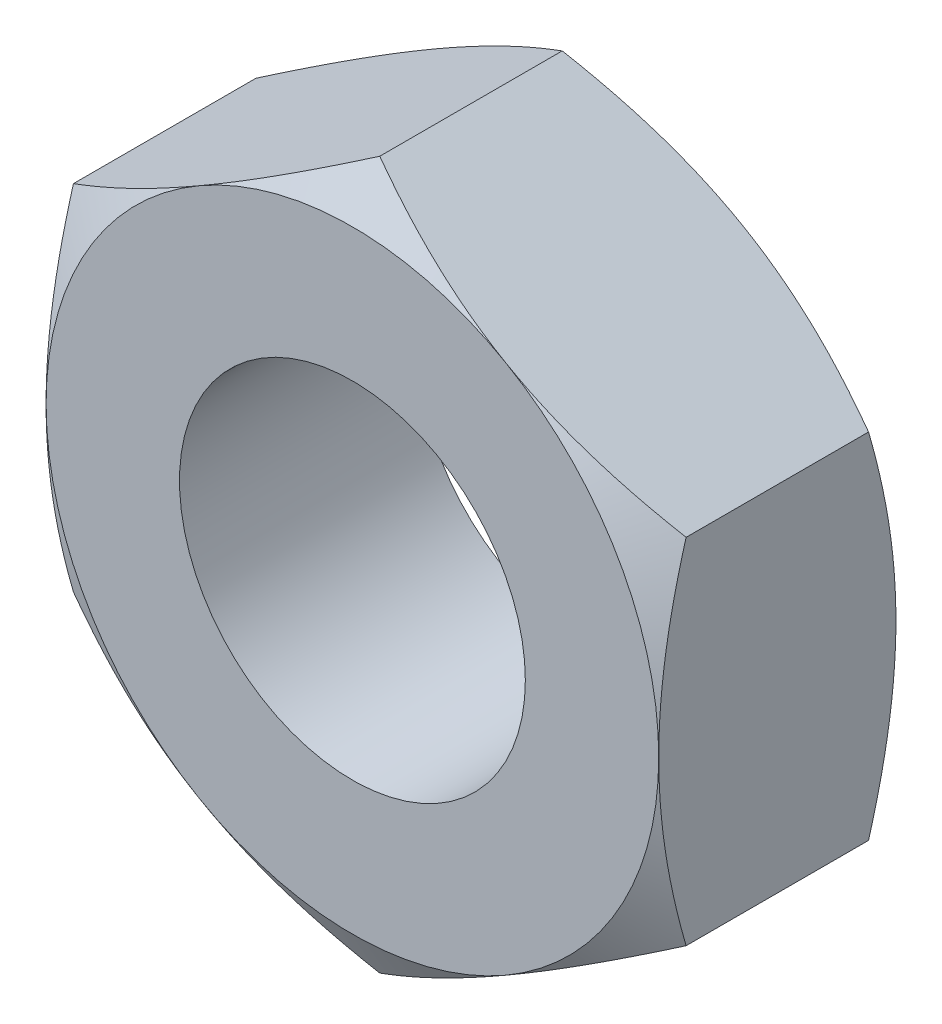
ISO-10303-21;
HEADER;
FILE_DESCRIPTION(('STEP AP214'),'2;1');
FILE_NAME('part.step','',(''),(''),'','','');
FILE_SCHEMA(('AUTOMOTIVE_DESIGN { 1 0 10303 214 1 1 1 1 }'));
ENDSEC;
DATA;
#1=APPLICATION_CONTEXT('core data for automotive mechanical design processes');
#2=APPLICATION_PROTOCOL_DEFINITION('international standard','automotive_design',2000,#1);
#3=PRODUCT_CONTEXT('',#1,'mechanical');
#4=PRODUCT('Part','Part','',(#3));
#5=PRODUCT_RELATED_PRODUCT_CATEGORY('part','',(#4));
#6=PRODUCT_DEFINITION_FORMATION('','',#4);
#7=PRODUCT_DEFINITION_CONTEXT('part definition',#1,'design');
#8=PRODUCT_DEFINITION('design','',#6,#7);
#9=PRODUCT_DEFINITION_SHAPE('','',#8);
#10=(LENGTH_UNIT() NAMED_UNIT(*) SI_UNIT(.MILLI.,.METRE.));
#11=(NAMED_UNIT(*) PLANE_ANGLE_UNIT() SI_UNIT($,.RADIAN.));
#12=(NAMED_UNIT(*) SI_UNIT($,.STERADIAN.) SOLID_ANGLE_UNIT());
#13=UNCERTAINTY_MEASURE_WITH_UNIT(LENGTH_MEASURE(1.E-05),#10,'distance_accuracy_value','');
#14=(GEOMETRIC_REPRESENTATION_CONTEXT(3) GLOBAL_UNCERTAINTY_ASSIGNED_CONTEXT((#13)) GLOBAL_UNIT_ASSIGNED_CONTEXT((#10,
#11,#12)) REPRESENTATION_CONTEXT('',''));
#15=CARTESIAN_POINT('',(0.,0.,0.));
#16=DIRECTION('',(0.,0.,1.));
#17=DIRECTION('',(1.,0.,0.));
#18=AXIS2_PLACEMENT_3D('',#15,#16,#17);
#19=CARTESIAN_POINT('',(3.09999999999999,1.78978583448784,2.4));
#20=DIRECTION('',(-0.500000000000003,-0.866025403784437,0.));
#21=DIRECTION('',(0.866025403784437,-0.500000000000003,0.));
#22=AXIS2_PLACEMENT_3D('',#19,#20,#21);
#23=PLANE('',#22);
#24=DIRECTION('',(0.,0.,-1.));
#25=VECTOR('',#24,1.);
#26=CARTESIAN_POINT('',(3.09999999999999,1.78978583448784,2.4));
#27=LINE('',#26,#25);
#28=CARTESIAN_POINT('',(3.09999999999999,1.78978583448784,2.12311916782118));
#29=VERTEX_POINT('',#28);
#30=CARTESIAN_POINT('',(3.09999999999999,1.78978583448784,0.276880832178823));
#31=VERTEX_POINT('',#30);
#32=EDGE_CURVE('E148',#29,#31,#27,.T.);
#33=ORIENTED_EDGE('',*,*,#32,.T.);
#34=CARTESIAN_POINT('',(3.10019999999999,1.789670364434,0.276947502071192));
#35=CARTESIAN_POINT('',(2.96397039903952,1.86832256122013,0.231520121347388));
#36=CARTESIAN_POINT('',(2.82656487355023,1.94765367834951,0.190205459784695));
#37=CARTESIAN_POINT('',(2.54937446268549,2.10768963667905,0.11809003945012));
#38=CARTESIAN_POINT('',(2.40958465173807,2.18839732165952,0.0873147929162139));
#39=CARTESIAN_POINT('',(2.13173747625081,2.34881246322066,0.0394082767925797));
#40=CARTESIAN_POINT('',(1.99372286382875,2.42849523685464,0.0219581701375264));
#41=CARTESIAN_POINT('',(1.71704417672768,2.58823575133148,0.00112574049382388));
#42=CARTESIAN_POINT('',(1.578381107815,2.66829291149487,-0.00227383287808569));
#43=CARTESIAN_POINT('',(1.31927767786437,2.81788634652482,0.0047954850763409));
#44=CARTESIAN_POINT('',(1.19879854553481,2.88744500600703,0.0135286181637454));
#45=CARTESIAN_POINT('',(0.958625207965761,3.02610914710469,0.0412084477848506));
#46=CARTESIAN_POINT('',(0.838931833544689,3.09521414904691,0.0601646013463644));
#47=CARTESIAN_POINT('',(0.59826323587599,3.23416422869643,0.1075538822576));
#48=CARTESIAN_POINT('',(0.47731847573528,3.30399171852074,0.136187907096622));
#49=CARTESIAN_POINT('',(0.237232901013239,3.44260518971506,0.201176022864358));
#50=CARTESIAN_POINT('',(0.118089010170212,3.51139294716558,0.237514842121463));
#51=CARTESIAN_POINT('',(-0.000200000000002321,3.57968713902953,0.276947502071202));
#52=B_SPLINE_CURVE_WITH_KNOTS('',3,(#34,#35,#36,#37,#38,#39,#40,#41,#42,#43,#44,#45,#46,#47,#48,
#49,#50,#51),.UNSPECIFIED.,.F.,.F.,(4,2,2,2,2,2,2,2,4),(0.,0.491390630656947,0.983962474910791,
1.46434314984851,1.94413386733015,2.36190975222244,2.78007277439126,3.2075118017031,
3.63411139268829),.UNSPECIFIED.);
#53=CARTESIAN_POINT('',(1.55000000000001,2.68467875173175,0.));
#54=VERTEX_POINT('',#53);
#55=EDGE_CURVE('E54',#31,#54,#52,.T.);
#56=ORIENTED_EDGE('',*,*,#55,.T.);
#57=CARTESIAN_POINT('',(0.,3.57957166897569,0.276880832178833));
#58=VERTEX_POINT('',#57);
#59=EDGE_CURVE('E122',#54,#58,#52,.T.);
#60=ORIENTED_EDGE('',*,*,#59,.T.);
#61=DIRECTION('',(0.,0.,-1.));
#62=VECTOR('',#61,1.);
#63=CARTESIAN_POINT('',(0.,3.57957166897569,2.4));
#64=LINE('',#63,#62);
#65=CARTESIAN_POINT('',(0.,3.57957166897569,2.12311916782117));
#66=VERTEX_POINT('',#65);
#67=EDGE_CURVE('E252',#66,#58,#64,.T.);
#68=ORIENTED_EDGE('',*,*,#67,.F.);
#69=CARTESIAN_POINT('',(3.10019999999999,1.789670364434,2.12305249792881));
#70=CARTESIAN_POINT('',(2.96397039903952,1.86832256122013,2.16847987865261));
#71=CARTESIAN_POINT('',(2.82656487355023,1.94765367834951,2.2097945402153));
#72=CARTESIAN_POINT('',(2.54937446268549,2.10768963667905,2.28190996054988));
#73=CARTESIAN_POINT('',(2.40958465173807,2.18839732165952,2.31268520708379));
#74=CARTESIAN_POINT('',(2.13173747625081,2.34881246322066,2.36059172320742));
#75=CARTESIAN_POINT('',(1.99372286382875,2.42849523685464,2.37804182986247));
#76=CARTESIAN_POINT('',(1.71704417672768,2.58823575133148,2.39887425950618));
#77=CARTESIAN_POINT('',(1.578381107815,2.66829291149487,2.40227383287809));
#78=CARTESIAN_POINT('',(1.31927767786437,2.81788634652482,2.39520451492366));
#79=CARTESIAN_POINT('',(1.19879854553481,2.88744500600703,2.38647138183625));
#80=CARTESIAN_POINT('',(0.958625207965761,3.02610914710469,2.35879155221515));
#81=CARTESIAN_POINT('',(0.838931833544689,3.09521414904691,2.33983539865364));
#82=CARTESIAN_POINT('',(0.59826323587599,3.23416422869643,2.2924461177424));
#83=CARTESIAN_POINT('',(0.47731847573528,3.30399171852074,2.26381209290338));
#84=CARTESIAN_POINT('',(0.237232901013238,3.44260518971506,2.19882397713564));
#85=CARTESIAN_POINT('',(0.118089010170212,3.51139294716558,2.16248515787854));
#86=CARTESIAN_POINT('',(-0.00020000000000232,3.57968713902953,2.1230524979288));
#87=B_SPLINE_CURVE_WITH_KNOTS('',3,(#69,#70,#71,#72,#73,#74,#75,#76,#77,#78,#79,#80,#81,#82,#83,
#84,#85,#86),.UNSPECIFIED.,.F.,.F.,(4,2,2,2,2,2,2,2,4),(0.,0.491390630656947,0.983962474910791,
1.46434314984851,1.94413386733015,2.36190975222244,2.78007277439126,3.2075118017031,
3.63411139268829),.UNSPECIFIED.);
#88=CARTESIAN_POINT('',(1.55000000000001,2.68467875173175,2.4));
#89=VERTEX_POINT('',#88);
#90=EDGE_CURVE('E233',#89,#66,#87,.T.);
#91=ORIENTED_EDGE('',*,*,#90,.F.);
#92=EDGE_CURVE('E238',#29,#89,#87,.T.);
#93=ORIENTED_EDGE('',*,*,#92,.F.);
#94=EDGE_LOOP('',(#33,#56,#60,#68,#91,#93));
#95=FACE_BOUND('',#94,.T.);
#96=ADVANCED_FACE('F33',(#95),#23,.F.);
#97=CARTESIAN_POINT('',(0.,3.57957166897569,2.4));
#98=DIRECTION('',(0.5,-0.866025403784439,0.));
#99=DIRECTION('',(0.866025403784439,0.5,0.));
#100=AXIS2_PLACEMENT_3D('',#97,#98,#99);
#101=PLANE('',#100);
#102=ORIENTED_EDGE('',*,*,#67,.T.);
#103=CARTESIAN_POINT('',(0.000199999999997686,3.57968713902953,0.276947502071202));
#104=CARTESIAN_POINT('',(-0.136029600960471,3.50103494224341,0.231520121347397));
#105=CARTESIAN_POINT('',(-0.273435126449768,3.42170382511402,0.190205459784704));
#106=CARTESIAN_POINT('',(-0.550625537314507,3.26166786678448,0.118090039450128));
#107=CARTESIAN_POINT('',(-0.690415348261932,3.18096018180402,0.0873147929162213));
#108=CARTESIAN_POINT('',(-0.968262523749189,3.02054504024287,0.0394082767925861));
#109=CARTESIAN_POINT('',(-1.10627713617125,2.94086226660889,0.0219581701375324));
#110=CARTESIAN_POINT('',(-1.38295582327232,2.78112175213206,0.00112574049382884));
#111=CARTESIAN_POINT('',(-1.521618892185,2.70106459196866,-0.00227383287808141));
#112=CARTESIAN_POINT('',(-1.78072232213563,2.55147115693871,0.00479548507634451));
#113=CARTESIAN_POINT('',(-1.90120145446519,2.4819124974565,0.0135286181637488));
#114=CARTESIAN_POINT('',(-2.14137479203424,2.34324835635884,0.041208447784853));
#115=CARTESIAN_POINT('',(-2.26106816645531,2.27414335441662,0.0601646013463661));
#116=CARTESIAN_POINT('',(-2.50173676412401,2.13519327476711,0.1075538822576));
#117=CARTESIAN_POINT('',(-2.62268152426472,2.0653657849428,0.136187907096622));
#118=CARTESIAN_POINT('',(-2.86276709898676,1.92675231374848,0.201176022864356));
#119=CARTESIAN_POINT('',(-2.98191098982979,1.85796455629796,0.237514842121461));
#120=CARTESIAN_POINT('',(-3.1002,1.78967036443401,0.276947502071198));
#121=B_SPLINE_CURVE_WITH_KNOTS('',3,(#103,#104,#105,#106,#107,#108,#109,#110,#111,#112,#113,
#114,#115,#116,#117,#118,#119,#120),.UNSPECIFIED.,.F.,.F.,(4,2,2,2,2,2,2,2,4),(0.,
0.491390630656949,0.983962474910796,1.46434314984852,1.94413386733016,2.36190975222244,
2.78007277439126,3.2075118017031,3.63411139268829),.UNSPECIFIED.);
#122=CARTESIAN_POINT('',(-1.55,2.68467875173176,0.));
#123=VERTEX_POINT('',#122);
#124=EDGE_CURVE('E127',#58,#123,#121,.T.);
#125=ORIENTED_EDGE('',*,*,#124,.T.);
#126=CARTESIAN_POINT('',(-3.1,1.78978583448785,0.276880832178829));
#127=VERTEX_POINT('',#126);
#128=EDGE_CURVE('E158',#123,#127,#121,.T.);
#129=ORIENTED_EDGE('',*,*,#128,.T.);
#130=DIRECTION('',(0.,0.,-1.));
#131=VECTOR('',#130,1.);
#132=CARTESIAN_POINT('',(-3.1,1.78978583448785,2.4));
#133=LINE('',#132,#131);
#134=CARTESIAN_POINT('',(-3.1,1.78978583448785,2.12311916782117));
#135=VERTEX_POINT('',#134);
#136=EDGE_CURVE('E249',#135,#127,#133,.T.);
#137=ORIENTED_EDGE('',*,*,#136,.F.);
#138=CARTESIAN_POINT('',(0.000199999999997715,3.57968713902953,2.1230524979288));
#139=CARTESIAN_POINT('',(-0.13602960096047,3.50103494224341,2.1684798786526));
#140=CARTESIAN_POINT('',(-0.273435126449768,3.42170382511402,2.2097945402153));
#141=CARTESIAN_POINT('',(-0.550625537314507,3.26166786678448,2.28190996054987));
#142=CARTESIAN_POINT('',(-0.690415348261932,3.18096018180402,2.31268520708378));
#143=CARTESIAN_POINT('',(-0.96826252374919,3.02054504024287,2.36059172320741));
#144=CARTESIAN_POINT('',(-1.10627713617125,2.94086226660889,2.37804182986247));
#145=CARTESIAN_POINT('',(-1.38295582327232,2.78112175213206,2.39887425950617));
#146=CARTESIAN_POINT('',(-1.521618892185,2.70106459196866,2.40227383287808));
#147=CARTESIAN_POINT('',(-1.78072232213563,2.55147115693871,2.39520451492366));
#148=CARTESIAN_POINT('',(-1.90120145446519,2.4819124974565,2.38647138183625));
#149=CARTESIAN_POINT('',(-2.14137479203424,2.34324835635884,2.35879155221515));
#150=CARTESIAN_POINT('',(-2.26106816645531,2.27414335441662,2.33983539865363));
#151=CARTESIAN_POINT('',(-2.50173676412401,2.13519327476711,2.2924461177424));
#152=CARTESIAN_POINT('',(-2.62268152426472,2.0653657849428,2.26381209290338));
#153=CARTESIAN_POINT('',(-2.86276709898676,1.92675231374848,2.19882397713564));
#154=CARTESIAN_POINT('',(-2.98191098982979,1.85796455629796,2.16248515787854));
#155=CARTESIAN_POINT('',(-3.1002,1.78967036443401,2.1230524979288));
#156=B_SPLINE_CURVE_WITH_KNOTS('',3,(#138,#139,#140,#141,#142,#143,#144,#145,#146,#147,#148,
#149,#150,#151,#152,#153,#154,#155),.UNSPECIFIED.,.F.,.F.,(4,2,2,2,2,2,2,2,4),(0.,
0.491390630656949,0.983962474910796,1.46434314984852,1.94413386733016,2.36190975222244,
2.78007277439126,3.2075118017031,3.63411139268828),.UNSPECIFIED.);
#157=CARTESIAN_POINT('',(-1.55,2.68467875173176,2.4));
#158=VERTEX_POINT('',#157);
#159=EDGE_CURVE('E227',#158,#135,#156,.T.);
#160=ORIENTED_EDGE('',*,*,#159,.F.);
#161=EDGE_CURVE('E232',#66,#158,#156,.T.);
#162=ORIENTED_EDGE('',*,*,#161,.F.);
#163=EDGE_LOOP('',(#102,#125,#129,#137,#160,#162));
#164=FACE_BOUND('',#163,.T.);
#165=ADVANCED_FACE('F208',(#164),#101,.F.);
#166=CARTESIAN_POINT('',(-3.1,1.78978583448785,2.4));
#167=DIRECTION('',(1.,0.,0.));
#168=DIRECTION('',(0.,0.,-1.));
#169=AXIS2_PLACEMENT_3D('',#166,#167,#168);
#170=PLANE('',#169);
#171=ORIENTED_EDGE('',*,*,#136,.T.);
#172=CARTESIAN_POINT('',(-3.1,-4.81271311094046,1.51537212886873));
#173=CARTESIAN_POINT('',(-3.1,-4.67725325474317,1.44964135128457));
#174=CARTESIAN_POINT('',(-3.1,-4.54148294955466,1.38453942265156));
#175=CARTESIAN_POINT('',(-3.1,-4.26915632867624,1.25594690533142));
#176=CARTESIAN_POINT('',(-3.1,-4.13259989359762,1.19245656976259));
#177=CARTESIAN_POINT('',(-3.1,-3.85783501166493,1.0671226689302));
#178=CARTESIAN_POINT('',(-3.1,-3.71962162183014,1.00528990264288));
#179=CARTESIAN_POINT('',(-3.1,-3.44209710202229,0.884148548425661));
#180=CARTESIAN_POINT('',(-3.1,-3.30278602418059,0.82483984146936));
#181=CARTESIAN_POINT('',(-3.1,-3.01836843390503,0.707567345806914));
#182=CARTESIAN_POINT('',(-3.1,-2.87321899048361,0.649707109458559));
#183=CARTESIAN_POINT('',(-3.1,-2.58122394562764,0.538353329221752));
#184=CARTESIAN_POINT('',(-3.1,-2.43437815628686,0.484860274489725));
#185=CARTESIAN_POINT('',(-3.1,-2.13902983456276,0.383641069761732));
#186=CARTESIAN_POINT('',(-3.1,-1.99053132448977,0.335903300643239));
#187=CARTESIAN_POINT('',(-3.1,-1.69140436864903,0.247722937455909));
#188=CARTESIAN_POINT('',(-3.1,-1.54077660796244,0.207278052049756));
#189=CARTESIAN_POINT('',(-3.1,-1.23812181195293,0.135831147781954));
#190=CARTESIAN_POINT('',(-3.1,-1.0861068333969,0.104778994885782));
#191=CARTESIAN_POINT('',(-3.1,-0.780181394728635,0.0538767116209993));
#192=CARTESIAN_POINT('',(-3.1,-0.62627112314021,0.0340254761542891));
#193=CARTESIAN_POINT('',(-3.1,-0.31933729668021,0.00736821991208423));
#194=CARTESIAN_POINT('',(-3.1,-0.166328719380625,0.000393994827882272));
#195=CARTESIAN_POINT('',(-3.1,0.139734819209859,-0.000361065698014016));
#196=CARTESIAN_POINT('',(-3.1,0.292789781589653,0.00585843721181667));
#197=CARTESIAN_POINT('',(-3.1,0.552443106279333,0.0271612510733355));
#198=CARTESIAN_POINT('',(-3.1,0.659318893504866,0.0390579331913427));
#199=CARTESIAN_POINT('',(-3.1,0.872287107506994,0.0685471382002425));
#200=CARTESIAN_POINT('',(-3.1,0.978379426731379,0.0861404287666638));
#201=CARTESIAN_POINT('',(-3.1,1.29533767040953,0.146540367741428));
#202=CARTESIAN_POINT('',(-3.1,1.50476964824319,0.196956375066906));
#203=CARTESIAN_POINT('',(-3.1,1.81800503712806,0.284382763522986));
#204=CARTESIAN_POINT('',(-3.1,1.92343087968106,0.31591094426472));
#205=CARTESIAN_POINT('',(-3.1,2.13325801254174,0.382239707814592));
#206=CARTESIAN_POINT('',(-3.1,2.23765929553585,0.41704031396347));
#207=CARTESIAN_POINT('',(-3.1,2.44547137812261,0.489355503889596));
#208=CARTESIAN_POINT('',(-3.1,2.54888248494952,0.526869212755777));
#209=CARTESIAN_POINT('',(-3.1,2.75484704985968,0.604169375182141));
#210=CARTESIAN_POINT('',(-3.1,2.85740052283004,0.643955789197623));
#211=CARTESIAN_POINT('',(-3.1,3.11839129018357,0.748004435854091));
#212=CARTESIAN_POINT('',(-3.1,3.27629298419082,0.813608415178438));
#213=CARTESIAN_POINT('',(-3.1,3.59060726100184,0.948302824176242));
#214=CARTESIAN_POINT('',(-3.1,3.7470197164046,1.01739354900345));
#215=CARTESIAN_POINT('',(-3.1,4.05866673501164,1.15828574602618));
#216=CARTESIAN_POINT('',(-3.1,4.21390096513805,1.23008795280182));
#217=CARTESIAN_POINT('',(-3.1,4.52337536160475,1.37580715153339));
#218=CARTESIAN_POINT('',(-3.1,4.67761550219107,1.44972419801096));
#219=CARTESIAN_POINT('',(-3.1,5.13952618022164,1.67416456655521));
#220=CARTESIAN_POINT('',(-3.1,5.44597971818287,1.82719000894438));
#221=CARTESIAN_POINT('',(-3.1,6.05661946365952,2.13754716786365));
#222=CARTESIAN_POINT('',(-3.1,6.36080603279155,2.29487817803568));
#223=CARTESIAN_POINT('',(-3.1,6.93852747105681,2.59730938966765));
#224=CARTESIAN_POINT('',(-3.1,7.21220559297371,2.74213642536651));
#225=CARTESIAN_POINT('',(-3.1,7.75861182506786,3.03360009879064));
#226=CARTESIAN_POINT('',(-3.1,8.03133988898186,3.18023682310219));
#227=CARTESIAN_POINT('',(-3.1,8.57527114960725,3.47444006014049));
#228=CARTESIAN_POINT('',(-3.1,8.84647647476626,3.6220026425095));
#229=CARTESIAN_POINT('',(-3.1,9.38828987035642,3.91817843806014));
#230=CARTESIAN_POINT('',(-3.1,9.65889797895943,4.06679158138233));
#231=CARTESIAN_POINT('',(-3.1,9.9292920292533,4.21579046875435));
#232=B_SPLINE_CURVE_WITH_KNOTS('',3,(#172,#173,#174,#175,#176,#177,#178,#179,#180,#181,#182,
#183,#184,#185,#186,#187,#188,#189,#190,#191,#192,#193,#194,#195,#196,#197,#198,#199,#200,#201,
#202,#203,#204,#205,#206,#207,#208,#209,#210,#211,#212,#213,#214,#215,#216,#217,#218,#219,#220,
#221,#222,#223,#224,#225,#226,#227,#228,#229,#230,#231),.UNSPECIFIED.,.F.,.F.,(4,2,2,2,2,2,2,2,
2,2,2,2,2,2,2,2,2,2,2,2,2,2,2,2,2,2,2,2,2,4),(0.,0.451701380433486,0.903473271947674,
1.3576953851437,1.81189605491955,2.28061195133272,2.74938027554722,3.21718578487089,
3.68484405819051,4.14996025737442,4.61503055951931,5.07398175344263,5.53294471725493,
5.85539611513145,6.17789098468844,6.8232263366688,7.15331602585133,7.48340806959375,
7.81339413709938,8.14337446464912,8.65627774457848,9.1692245149459,9.68231126132092,
10.1954112472704,11.2229554301614,12.2503320361586,13.1792315129445,14.1081756074621,
15.0344253693908,15.9606141070192),.UNSPECIFIED.);
#233=CARTESIAN_POINT('',(-3.1,0.,0.));
#234=VERTEX_POINT('',#233);
#235=EDGE_CURVE('E202',#127,#234,#232,.F.);
#236=ORIENTED_EDGE('',*,*,#235,.T.);
#237=CARTESIAN_POINT('',(-3.1,-1.78978583448784,0.276880832178825));
#238=VERTEX_POINT('',#237);
#239=EDGE_CURVE('E196',#234,#238,#232,.F.);
#240=ORIENTED_EDGE('',*,*,#239,.T.);
#241=DIRECTION('',(0.,0.,-1.));
#242=VECTOR('',#241,1.);
#243=CARTESIAN_POINT('',(-3.1,-1.78978583448784,2.4));
#244=LINE('',#243,#242);
#245=CARTESIAN_POINT('',(-3.1,-1.78978583448784,2.12311916782117));
#246=VERTEX_POINT('',#245);
#247=EDGE_CURVE('E246',#246,#238,#244,.T.);
#248=ORIENTED_EDGE('',*,*,#247,.F.);
#249=CARTESIAN_POINT('',(-3.1,-4.81271311094046,0.88462787113127));
#250=CARTESIAN_POINT('',(-3.1,-4.67725325474317,0.950358648715434));
#251=CARTESIAN_POINT('',(-3.1,-4.54148294955465,1.01546057734844));
#252=CARTESIAN_POINT('',(-3.1,-4.26915632867624,1.14405309466858));
#253=CARTESIAN_POINT('',(-3.1,-4.13259989359762,1.20754343023741));
#254=CARTESIAN_POINT('',(-3.1,-3.85783501166493,1.3328773310698));
#255=CARTESIAN_POINT('',(-3.1,-3.71962162183014,1.39471009735712));
#256=CARTESIAN_POINT('',(-3.1,-3.44209710202229,1.51585145157434));
#257=CARTESIAN_POINT('',(-3.1,-3.30278602418059,1.57516015853064));
#258=CARTESIAN_POINT('',(-3.1,-3.01836843390503,1.69243265419309));
#259=CARTESIAN_POINT('',(-3.1,-2.87321899048361,1.75029289054144));
#260=CARTESIAN_POINT('',(-3.1,-2.58122394562764,1.86164667077825));
#261=CARTESIAN_POINT('',(-3.1,-2.43437815628686,1.91513972551028));
#262=CARTESIAN_POINT('',(-3.1,-2.13902983456276,2.01635893023827));
#263=CARTESIAN_POINT('',(-3.1,-1.99053132448978,2.06409669935676));
#264=CARTESIAN_POINT('',(-3.1,-1.69140436864903,2.15227706254409));
#265=CARTESIAN_POINT('',(-3.1,-1.54077660796244,2.19272194795024));
#266=CARTESIAN_POINT('',(-3.1,-1.23812181195293,2.26416885221805));
#267=CARTESIAN_POINT('',(-3.1,-1.0861068333969,2.29522100511422));
#268=CARTESIAN_POINT('',(-3.1,-0.780181394728635,2.346123288379));
#269=CARTESIAN_POINT('',(-3.1,-0.62627112314021,2.36597452384571));
#270=CARTESIAN_POINT('',(-3.1,-0.31933729668021,2.39263178008792));
#271=CARTESIAN_POINT('',(-3.1,-0.166328719380624,2.39960600517212));
#272=CARTESIAN_POINT('',(-3.1,0.139734819209859,2.40036106569801));
#273=CARTESIAN_POINT('',(-3.1,0.292789781589653,2.39414156278818));
#274=CARTESIAN_POINT('',(-3.1,0.552443106279333,2.37283874892666));
#275=CARTESIAN_POINT('',(-3.1,0.659318893504865,2.36094206680866));
#276=CARTESIAN_POINT('',(-3.1,0.872287107506993,2.33145286179976));
#277=CARTESIAN_POINT('',(-3.1,0.978379426731378,2.31385957123334));
#278=CARTESIAN_POINT('',(-3.1,1.29533767040953,2.25345963225857));
#279=CARTESIAN_POINT('',(-3.1,1.50476964824319,2.20304362493309));
#280=CARTESIAN_POINT('',(-3.1,1.81800503712806,2.11561723647701));
#281=CARTESIAN_POINT('',(-3.1,1.92343087968106,2.08408905573528));
#282=CARTESIAN_POINT('',(-3.1,2.13325801254174,2.01776029218541));
#283=CARTESIAN_POINT('',(-3.1,2.23765929553584,1.98295968603653));
#284=CARTESIAN_POINT('',(-3.1,2.44547137812261,1.9106444961104));
#285=CARTESIAN_POINT('',(-3.1,2.54888248494952,1.87313078724422));
#286=CARTESIAN_POINT('',(-3.1,2.75484704985968,1.79583062481786));
#287=CARTESIAN_POINT('',(-3.1,2.85740052283004,1.75604421080238));
#288=CARTESIAN_POINT('',(-3.1,3.11839129018357,1.65199556414591));
#289=CARTESIAN_POINT('',(-3.1,3.27629298419082,1.58639158482156));
#290=CARTESIAN_POINT('',(-3.1,3.59060726100184,1.45169717582376));
#291=CARTESIAN_POINT('',(-3.1,3.7470197164046,1.38260645099655));
#292=CARTESIAN_POINT('',(-3.1,4.05866673501164,1.24171425397382));
#293=CARTESIAN_POINT('',(-3.1,4.21390096513805,1.16991204719818));
#294=CARTESIAN_POINT('',(-3.1,4.52337536160475,1.02419284846661));
#295=CARTESIAN_POINT('',(-3.1,4.67761550219108,0.950275801989039));
#296=CARTESIAN_POINT('',(-3.1,5.13952618022164,0.725835433444792));
#297=CARTESIAN_POINT('',(-3.1,5.44597971818287,0.572809991055616));
#298=CARTESIAN_POINT('',(-3.1,6.05661946365952,0.262452832136352));
#299=CARTESIAN_POINT('',(-3.1,6.36080603279155,0.105121821964322));
#300=CARTESIAN_POINT('',(-3.1,6.93852747105682,-0.197309389667646));
#301=CARTESIAN_POINT('',(-3.1,7.21220559297371,-0.342136425366515));
#302=CARTESIAN_POINT('',(-3.1,7.75861182506786,-0.633600098790644));
#303=CARTESIAN_POINT('',(-3.1,8.03133988898186,-0.780236823102191));
#304=CARTESIAN_POINT('',(-3.1,8.57527114960725,-1.07444006014049));
#305=CARTESIAN_POINT('',(-3.1,8.84647647476626,-1.2220026425095));
#306=CARTESIAN_POINT('',(-3.1,9.38828987035642,-1.51817843806014));
#307=CARTESIAN_POINT('',(-3.1,9.65889797895943,-1.66679158138233));
#308=CARTESIAN_POINT('',(-3.1,9.9292920292533,-1.81579046875435));
#309=B_SPLINE_CURVE_WITH_KNOTS('',3,(#249,#250,#251,#252,#253,#254,#255,#256,#257,#258,#259,
#260,#261,#262,#263,#264,#265,#266,#267,#268,#269,#270,#271,#272,#273,#274,#275,#276,#277,#278,
#279,#280,#281,#282,#283,#284,#285,#286,#287,#288,#289,#290,#291,#292,#293,#294,#295,#296,#297,
#298,#299,#300,#301,#302,#303,#304,#305,#306,#307,#308),.UNSPECIFIED.,.F.,.F.,(4,2,2,2,2,2,2,2,
2,2,2,2,2,2,2,2,2,2,2,2,2,2,2,2,2,2,2,2,2,4),(0.,0.451701380433486,0.903473271947673,
1.3576953851437,1.81189605491955,2.28061195133272,2.74938027554722,3.21718578487089,
3.68484405819051,4.14996025737442,4.61503055951931,5.07398175344263,5.53294471725493,
5.85539611513145,6.17789098468843,6.8232263366688,7.15331602585133,7.48340806959375,
7.81339413709938,8.14337446464912,8.65627774457848,9.1692245149459,9.68231126132093,
10.1954112472704,11.2229554301614,12.2503320361586,13.1792315129445,14.1081756074621,
15.0344253693908,15.9606141070192),.UNSPECIFIED.);
#310=CARTESIAN_POINT('',(-3.1,0.,2.4));
#311=VERTEX_POINT('',#310);
#312=EDGE_CURVE('E214',#311,#246,#309,.F.);
#313=ORIENTED_EDGE('',*,*,#312,.F.);
#314=EDGE_CURVE('E220',#135,#311,#309,.F.);
#315=ORIENTED_EDGE('',*,*,#314,.F.);
#316=EDGE_LOOP('',(#171,#236,#240,#248,#313,#315));
#317=FACE_BOUND('',#316,.T.);
#318=ADVANCED_FACE('F204',(#317),#170,.F.);
#319=CARTESIAN_POINT('',(-3.1,-1.78978583448784,2.4));
#320=DIRECTION('',(0.499999999999998,0.86602540378444,0.));
#321=DIRECTION('',(-0.86602540378444,0.499999999999998,0.));
#322=AXIS2_PLACEMENT_3D('',#319,#320,#321);
#323=PLANE('',#322);
#324=ORIENTED_EDGE('',*,*,#247,.T.);
#325=CARTESIAN_POINT('',(-3.1002,-1.789670364434,0.276947502071194));
#326=CARTESIAN_POINT('',(-2.96397039903953,-1.86832256122012,0.23152012134739));
#327=CARTESIAN_POINT('',(-2.82656487355023,-1.94765367834951,0.190205459784696));
#328=CARTESIAN_POINT('',(-2.5493744626855,-2.10768963667905,0.11809003945012));
#329=CARTESIAN_POINT('',(-2.40958465173807,-2.18839732165951,0.0873147929162129));
#330=CARTESIAN_POINT('',(-2.13173747625081,-2.34881246322065,0.0394082767925773));
#331=CARTESIAN_POINT('',(-1.99372286382875,-2.42849523685463,0.0219581701375234));
#332=CARTESIAN_POINT('',(-1.71704417672768,-2.58823575133147,0.00112574049381937));
#333=CARTESIAN_POINT('',(-1.578381107815,-2.66829291149486,-0.00227383287809113));
#334=CARTESIAN_POINT('',(-1.31927767786437,-2.81788634652481,0.00479548507633417));
#335=CARTESIAN_POINT('',(-1.19879854553481,-2.88744500600702,0.0135286181637382));
#336=CARTESIAN_POINT('',(-0.958625207965761,-3.02610914710468,0.0412084477848422));
#337=CARTESIAN_POINT('',(-0.838931833544688,-3.0952141490469,0.0601646013463552));
#338=CARTESIAN_POINT('',(-0.598263235875989,-3.23416422869641,0.107553882257589));
#339=CARTESIAN_POINT('',(-0.477318475735278,-3.30399171852072,0.136187907096612));
#340=CARTESIAN_POINT('',(-0.237232901013235,-3.44260518971504,0.201176022864346));
#341=CARTESIAN_POINT('',(-0.118089010170208,-3.51139294716556,0.237514842121452));
#342=CARTESIAN_POINT('',(0.000200000000006558,-3.57968713902951,0.27694750207119));
#343=B_SPLINE_CURVE_WITH_KNOTS('',3,(#325,#326,#327,#328,#329,#330,#331,#332,#333,#334,#335,
#336,#337,#338,#339,#340,#341,#342),.UNSPECIFIED.,.F.,.F.,(4,2,2,2,2,2,2,2,4),(0.,
0.491390630656948,0.983962474910792,1.46434314984851,1.94413386733015,2.36190975222244,
2.78007277439126,3.2075118017031,3.63411139268829),.UNSPECIFIED.);
#344=CARTESIAN_POINT('',(-1.54999999999999,-2.68467875173176,0.));
#345=VERTEX_POINT('',#344);
#346=EDGE_CURVE('E203',#238,#345,#343,.T.);
#347=ORIENTED_EDGE('',*,*,#346,.T.);
#348=CARTESIAN_POINT('',(0.,-3.57957166897567,0.276880832178821));
#349=VERTEX_POINT('',#348);
#350=EDGE_CURVE('E191',#345,#349,#343,.T.);
#351=ORIENTED_EDGE('',*,*,#350,.T.);
#352=DIRECTION('',(0.,0.,-1.));
#353=VECTOR('',#352,1.);
#354=CARTESIAN_POINT('',(0.,-3.57957166897567,2.4));
#355=LINE('',#354,#353);
#356=CARTESIAN_POINT('',(0.,-3.57957166897567,2.12311916782118));
#357=VERTEX_POINT('',#356);
#358=EDGE_CURVE('E243',#357,#349,#355,.T.);
#359=ORIENTED_EDGE('',*,*,#358,.F.);
#360=CARTESIAN_POINT('',(-3.1002,-1.789670364434,2.12305249792881));
#361=CARTESIAN_POINT('',(-2.96397039903953,-1.86832256122012,2.16847987865261));
#362=CARTESIAN_POINT('',(-2.82656487355023,-1.94765367834951,2.2097945402153));
#363=CARTESIAN_POINT('',(-2.5493744626855,-2.10768963667905,2.28190996054988));
#364=CARTESIAN_POINT('',(-2.40958465173807,-2.18839732165951,2.31268520708379));
#365=CARTESIAN_POINT('',(-2.13173747625081,-2.34881246322065,2.36059172320742));
#366=CARTESIAN_POINT('',(-1.99372286382875,-2.42849523685463,2.37804182986248));
#367=CARTESIAN_POINT('',(-1.71704417672768,-2.58823575133147,2.39887425950618));
#368=CARTESIAN_POINT('',(-1.578381107815,-2.66829291149486,2.40227383287809));
#369=CARTESIAN_POINT('',(-1.31927767786437,-2.81788634652481,2.39520451492367));
#370=CARTESIAN_POINT('',(-1.19879854553481,-2.88744500600702,2.38647138183626));
#371=CARTESIAN_POINT('',(-0.958625207965761,-3.02610914710468,2.35879155221516));
#372=CARTESIAN_POINT('',(-0.838931833544688,-3.0952141490469,2.33983539865364));
#373=CARTESIAN_POINT('',(-0.598263235875989,-3.23416422869641,2.29244611774241));
#374=CARTESIAN_POINT('',(-0.477318475735278,-3.30399171852072,2.26381209290339));
#375=CARTESIAN_POINT('',(-0.237232901013235,-3.44260518971504,2.19882397713565));
#376=CARTESIAN_POINT('',(-0.118089010170208,-3.51139294716556,2.16248515787855));
#377=CARTESIAN_POINT('',(0.000200000000006556,-3.57968713902951,2.12305249792881));
#378=B_SPLINE_CURVE_WITH_KNOTS('',3,(#360,#361,#362,#363,#364,#365,#366,#367,#368,#369,#370,
#371,#372,#373,#374,#375,#376,#377),.UNSPECIFIED.,.F.,.F.,(4,2,2,2,2,2,2,2,4),(0.,
0.491390630656948,0.983962474910792,1.46434314984851,1.94413386733015,2.36190975222244,
2.78007277439126,3.2075118017031,3.63411139268829),.UNSPECIFIED.);
#379=CARTESIAN_POINT('',(-1.54999999999999,-2.68467875173176,2.4));
#380=VERTEX_POINT('',#379);
#381=EDGE_CURVE('E222',#380,#357,#378,.T.);
#382=ORIENTED_EDGE('',*,*,#381,.F.);
#383=EDGE_CURVE('E221',#246,#380,#378,.T.);
#384=ORIENTED_EDGE('',*,*,#383,.F.);
#385=EDGE_LOOP('',(#324,#347,#351,#359,#382,#384));
#386=FACE_BOUND('',#385,.T.);
#387=ADVANCED_FACE('F207',(#386),#323,.F.);
#388=CARTESIAN_POINT('',(0.,-3.57957166897567,2.4));
#389=DIRECTION('',(-0.499999999999999,0.86602540378444,0.));
#390=DIRECTION('',(-0.86602540378444,-0.499999999999999,0.));
#391=AXIS2_PLACEMENT_3D('',#388,#389,#390);
#392=PLANE('',#391);
#393=ORIENTED_EDGE('',*,*,#358,.T.);
#394=CARTESIAN_POINT('',(-0.000199999999993108,-3.57968713902951,0.27694750207119));
#395=CARTESIAN_POINT('',(0.136029600960475,-3.50103494224339,0.231520121347386));
#396=CARTESIAN_POINT('',(0.273435126449771,-3.421703825114,0.190205459784693));
#397=CARTESIAN_POINT('',(0.550625537314509,-3.26166786678446,0.118090039450118));
#398=CARTESIAN_POINT('',(0.690415348261933,-3.180960181804,0.0873147929162118));
#399=CARTESIAN_POINT('',(0.96826252374919,-3.02054504024286,0.0394082767925775));
#400=CARTESIAN_POINT('',(1.10627713617125,-2.94086226660888,0.0219581701375242));
#401=CARTESIAN_POINT('',(1.38295582327232,-2.78112175213204,0.00112574049382133));
#402=CARTESIAN_POINT('',(1.521618892185,-2.70106459196865,-0.0022738328780885));
#403=CARTESIAN_POINT('',(1.78072232213563,-2.5514711569387,0.00479548507633783));
#404=CARTESIAN_POINT('',(1.90120145446519,-2.48191249745649,0.0135286181637422));
#405=CARTESIAN_POINT('',(2.14137479203424,-2.34324835635883,0.0412084477848472));
#406=CARTESIAN_POINT('',(2.26106816645531,-2.27414335441661,0.0601646013463609));
#407=CARTESIAN_POINT('',(2.50173676412401,-2.1351932747671,0.107553882257596));
#408=CARTESIAN_POINT('',(2.62268152426472,-2.06536578494279,0.136187907096618));
#409=CARTESIAN_POINT('',(2.86276709898676,-1.92675231374847,0.201176022864352));
#410=CARTESIAN_POINT('',(2.98191098982978,-1.85796455629795,0.237514842121457));
#411=CARTESIAN_POINT('',(3.1002,-1.789670364434,0.276947502071195));
#412=B_SPLINE_CURVE_WITH_KNOTS('',3,(#394,#395,#396,#397,#398,#399,#400,#401,#402,#403,#404,
#405,#406,#407,#408,#409,#410,#411),.UNSPECIFIED.,.F.,.F.,(4,2,2,2,2,2,2,2,4),(0.,
0.491390630656946,0.98396247491079,1.46434314984851,1.94413386733015,2.36190975222243,
2.78007277439125,3.20751180170309,3.63411139268828),.UNSPECIFIED.);
#413=CARTESIAN_POINT('',(1.54999999999999,-2.68467875173176,0.));
#414=VERTEX_POINT('',#413);
#415=EDGE_CURVE('E330',#349,#414,#412,.T.);
#416=ORIENTED_EDGE('',*,*,#415,.T.);
#417=CARTESIAN_POINT('',(3.1,-1.78978583448829,0.276880832178525));
#418=VERTEX_POINT('',#417);
#419=EDGE_CURVE('E185',#414,#418,#412,.T.);
#420=ORIENTED_EDGE('',*,*,#419,.T.);
#421=DIRECTION('',(0.,0.,-1.));
#422=VECTOR('',#421,1.);
#423=CARTESIAN_POINT('',(3.1,-1.78978583448784,2.4));
#424=LINE('',#423,#422);
#425=CARTESIAN_POINT('',(3.1,-1.78978583448829,2.12311916782147));
#426=VERTEX_POINT('',#425);
#427=EDGE_CURVE('E240',#426,#418,#424,.T.);
#428=ORIENTED_EDGE('',*,*,#427,.F.);
#429=CARTESIAN_POINT('',(-0.000199999999993108,-3.57968713902951,2.12305249792881));
#430=CARTESIAN_POINT('',(0.136029600960474,-3.50103494224339,2.16847987865261));
#431=CARTESIAN_POINT('',(0.273435126449771,-3.421703825114,2.20979454021531));
#432=CARTESIAN_POINT('',(0.550625537314509,-3.26166786678446,2.28190996054988));
#433=CARTESIAN_POINT('',(0.690415348261933,-3.180960181804,2.31268520708379));
#434=CARTESIAN_POINT('',(0.968262523749189,-3.02054504024286,2.36059172320742));
#435=CARTESIAN_POINT('',(1.10627713617125,-2.94086226660888,2.37804182986248));
#436=CARTESIAN_POINT('',(1.38295582327232,-2.78112175213204,2.39887425950618));
#437=CARTESIAN_POINT('',(1.521618892185,-2.70106459196865,2.40227383287809));
#438=CARTESIAN_POINT('',(1.78072232213563,-2.5514711569387,2.39520451492366));
#439=CARTESIAN_POINT('',(1.90120145446519,-2.48191249745649,2.38647138183626));
#440=CARTESIAN_POINT('',(2.14137479203424,-2.34324835635883,2.35879155221515));
#441=CARTESIAN_POINT('',(2.26106816645531,-2.27414335441661,2.33983539865364));
#442=CARTESIAN_POINT('',(2.50173676412401,-2.1351932747671,2.2924461177424));
#443=CARTESIAN_POINT('',(2.62268152426472,-2.06536578494279,2.26381209290338));
#444=CARTESIAN_POINT('',(2.86276709898676,-1.92675231374847,2.19882397713565));
#445=CARTESIAN_POINT('',(2.98191098982978,-1.85796455629795,2.16248515787854));
#446=CARTESIAN_POINT('',(3.1002,-1.789670364434,2.1230524979288));
#447=B_SPLINE_CURVE_WITH_KNOTS('',3,(#429,#430,#431,#432,#433,#434,#435,#436,#437,#438,#439,
#440,#441,#442,#443,#444,#445,#446),.UNSPECIFIED.,.F.,.F.,(4,2,2,2,2,2,2,2,4),(0.,
0.491390630656946,0.98396247491079,1.46434314984851,1.94413386733015,2.36190975222243,
2.78007277439125,3.20751180170309,3.63411139268828),.UNSPECIFIED.);
#448=CARTESIAN_POINT('',(1.54999999999999,-2.68467875173176,2.4));
#449=VERTEX_POINT('',#448);
#450=EDGE_CURVE('E281',#449,#426,#447,.T.);
#451=ORIENTED_EDGE('',*,*,#450,.F.);
#452=EDGE_CURVE('E280',#357,#449,#447,.T.);
#453=ORIENTED_EDGE('',*,*,#452,.F.);
#454=EDGE_LOOP('',(#393,#416,#420,#428,#451,#453));
#455=FACE_BOUND('',#454,.T.);
#456=ADVANCED_FACE('F289',(#455),#392,.F.);
#457=CARTESIAN_POINT('',(3.1,-1.78978583448784,2.4));
#458=DIRECTION('',(-1.,0.,0.));
#459=DIRECTION('',(0.,-1.,0.));
#460=AXIS2_PLACEMENT_3D('',#457,#458,#459);
#461=PLANE('',#460);
#462=ORIENTED_EDGE('',*,*,#427,.T.);
#463=CARTESIAN_POINT('',(3.1,-4.81271311094046,1.51537212886873));
#464=CARTESIAN_POINT('',(3.1,-4.67725325474317,1.44964135128457));
#465=CARTESIAN_POINT('',(3.1,-4.54148294955466,1.38453942265157));
#466=CARTESIAN_POINT('',(3.1,-4.26915632867624,1.25594690533142));
#467=CARTESIAN_POINT('',(3.1,-4.13259989359763,1.19245656976259));
#468=CARTESIAN_POINT('',(3.1,-3.85783501166493,1.06712266893021));
#469=CARTESIAN_POINT('',(3.1,-3.71962162183015,1.00528990264289));
#470=CARTESIAN_POINT('',(3.1,-3.44209710202229,0.884148548425664));
#471=CARTESIAN_POINT('',(3.1,-3.30278602418059,0.824839841469363));
#472=CARTESIAN_POINT('',(3.1,-3.01836843390504,0.707567345806917));
#473=CARTESIAN_POINT('',(3.1,-2.87321899048361,0.649707109458562));
#474=CARTESIAN_POINT('',(3.1,-2.58122394562764,0.538353329221754));
#475=CARTESIAN_POINT('',(3.1,-2.43437815628686,0.484860274489727));
#476=CARTESIAN_POINT('',(3.1,-2.13902983456277,0.383641069761734));
#477=CARTESIAN_POINT('',(3.1,-1.99053132448978,0.335903300643241));
#478=CARTESIAN_POINT('',(3.1,-1.69140436864903,0.247722937455911));
#479=CARTESIAN_POINT('',(3.1,-1.54077660796245,0.207278052049757));
#480=CARTESIAN_POINT('',(3.1,-1.23812181195294,0.135831147781954));
#481=CARTESIAN_POINT('',(3.1,-1.0861068333969,0.104778994885782));
#482=CARTESIAN_POINT('',(3.1,-0.780181394728641,0.0538767116209991));
#483=CARTESIAN_POINT('',(3.1,-0.626271123140215,0.0340254761542885));
#484=CARTESIAN_POINT('',(3.1,-0.319337296680215,0.00736821991208287));
#485=CARTESIAN_POINT('',(3.1,-0.16632871938063,0.000393994827880563));
#486=CARTESIAN_POINT('',(3.09999999999999,0.139734819209854,-0.000361065698016282));
#487=CARTESIAN_POINT('',(3.09999999999999,0.292789781589648,0.00585843721181419));
#488=CARTESIAN_POINT('',(3.09999999999999,0.552443106279328,0.0271612510733325));
#489=CARTESIAN_POINT('',(3.09999999999999,0.65931889350486,0.0390579331913394));
#490=CARTESIAN_POINT('',(3.09999999999999,0.872287107506987,0.0685471382002386));
#491=CARTESIAN_POINT('',(3.09999999999999,0.978379426731372,0.0861404287666596));
#492=CARTESIAN_POINT('',(3.09999999999999,1.29533767040952,0.146540367741423));
#493=CARTESIAN_POINT('',(3.09999999999999,1.50476964824318,0.196956375066901));
#494=CARTESIAN_POINT('',(3.09999999999999,1.81800503712806,0.28438276352298));
#495=CARTESIAN_POINT('',(3.09999999999999,1.92343087968105,0.315910944264713));
#496=CARTESIAN_POINT('',(3.09999999999999,2.13325801254173,0.382239707814585));
#497=CARTESIAN_POINT('',(3.09999999999999,2.23765929553584,0.417040313963463));
#498=CARTESIAN_POINT('',(3.09999999999999,2.4454713781226,0.489355503889588));
#499=CARTESIAN_POINT('',(3.09999999999999,2.54888248494951,0.52686921275577));
#500=CARTESIAN_POINT('',(3.09999999999999,2.75484704985967,0.604169375182132));
#501=CARTESIAN_POINT('',(3.09999999999999,2.85740052283003,0.643955789197614));
#502=CARTESIAN_POINT('',(3.09999999999999,3.11839129018356,0.748004435854082));
#503=CARTESIAN_POINT('',(3.09999999999999,3.27629298419081,0.813608415178429));
#504=CARTESIAN_POINT('',(3.09999999999999,3.59060726100182,0.948302824176233));
#505=CARTESIAN_POINT('',(3.09999999999999,3.74701971640459,1.01739354900344));
#506=CARTESIAN_POINT('',(3.09999999999999,4.05866673501163,1.15828574602617));
#507=CARTESIAN_POINT('',(3.09999999999999,4.21390096513804,1.23008795280181));
#508=CARTESIAN_POINT('',(3.09999999999999,4.52337536160473,1.37580715153338));
#509=CARTESIAN_POINT('',(3.09999999999999,4.67761550219106,1.44972419801095));
#510=CARTESIAN_POINT('',(3.09999999999998,5.13952618022162,1.6741645665552));
#511=CARTESIAN_POINT('',(3.09999999999998,5.44597971818285,1.82719000894437));
#512=CARTESIAN_POINT('',(3.09999999999998,6.0566194636595,2.13754716786363));
#513=CARTESIAN_POINT('',(3.09999999999998,6.36080603279153,2.29487817803566));
#514=CARTESIAN_POINT('',(3.09999999999998,6.93852747105679,2.59730938966763));
#515=CARTESIAN_POINT('',(3.09999999999998,7.21220559297369,2.7421364253665));
#516=CARTESIAN_POINT('',(3.09999999999998,7.75861182506783,3.03360009879063));
#517=CARTESIAN_POINT('',(3.09999999999998,8.03133988898184,3.18023682310218));
#518=CARTESIAN_POINT('',(3.09999999999998,8.57527114960723,3.47444006014047));
#519=CARTESIAN_POINT('',(3.09999999999998,8.84647647476624,3.62200264250948));
#520=CARTESIAN_POINT('',(3.09999999999998,9.38828987035639,3.91817843806012));
#521=CARTESIAN_POINT('',(3.09999999999998,9.65889797895941,4.06679158138231));
#522=CARTESIAN_POINT('',(3.09999999999998,9.92929202925328,4.21579046875433));
#523=B_SPLINE_CURVE_WITH_KNOTS('',3,(#463,#464,#465,#466,#467,#468,#469,#470,#471,#472,#473,
#474,#475,#476,#477,#478,#479,#480,#481,#482,#483,#484,#485,#486,#487,#488,#489,#490,#491,#492,
#493,#494,#495,#496,#497,#498,#499,#500,#501,#502,#503,#504,#505,#506,#507,#508,#509,#510,#511,
#512,#513,#514,#515,#516,#517,#518,#519,#520,#521,#522),.UNSPECIFIED.,.F.,.F.,(4,2,2,2,2,2,2,2,
2,2,2,2,2,2,2,2,2,2,2,2,2,2,2,2,2,2,2,2,2,4),(0.,0.451701380433486,0.903473271947674,
1.3576953851437,1.81189605491955,2.28061195133272,2.74938027554722,3.21718578487089,
3.68484405819051,4.14996025737442,4.6150305595193,5.07398175344263,5.53294471725493,
5.85539611513144,6.17789098468843,6.8232263366688,7.15331602585133,7.48340806959374,
7.81339413709938,8.14337446464911,8.65627774457848,9.16922451494589,9.68231126132092,
10.1954112472704,11.2229554301614,12.2503320361586,13.1792315129445,14.1081756074621,
15.0344253693908,15.9606141070191),.UNSPECIFIED.);
#524=CARTESIAN_POINT('',(3.1,0.,0.));
#525=VERTEX_POINT('',#524);
#526=EDGE_CURVE('E329',#418,#525,#523,.T.);
#527=ORIENTED_EDGE('',*,*,#526,.T.);
#528=EDGE_CURVE('E135',#525,#31,#523,.T.);
#529=ORIENTED_EDGE('',*,*,#528,.T.);
#530=ORIENTED_EDGE('',*,*,#32,.F.);
#531=CARTESIAN_POINT('',(3.1,-4.81271311094046,0.884627871131267));
#532=CARTESIAN_POINT('',(3.1,-4.67725325474317,0.950358648715431));
#533=CARTESIAN_POINT('',(3.1,-4.54148294955466,1.01546057734843));
#534=CARTESIAN_POINT('',(3.1,-4.26915632867624,1.14405309466858));
#535=CARTESIAN_POINT('',(3.1,-4.13259989359763,1.20754343023741));
#536=CARTESIAN_POINT('',(3.1,-3.85783501166493,1.33287733106979));
#537=CARTESIAN_POINT('',(3.1,-3.71962162183015,1.39471009735711));
#538=CARTESIAN_POINT('',(3.1,-3.44209710202229,1.51585145157434));
#539=CARTESIAN_POINT('',(3.1,-3.30278602418059,1.57516015853064));
#540=CARTESIAN_POINT('',(3.1,-3.01836843390504,1.69243265419308));
#541=CARTESIAN_POINT('',(3.1,-2.87321899048361,1.75029289054144));
#542=CARTESIAN_POINT('',(3.1,-2.58122394562764,1.86164667077825));
#543=CARTESIAN_POINT('',(3.1,-2.43437815628686,1.91513972551027));
#544=CARTESIAN_POINT('',(3.1,-2.13902983456277,2.01635893023827));
#545=CARTESIAN_POINT('',(3.1,-1.99053132448978,2.06409669935676));
#546=CARTESIAN_POINT('',(3.1,-1.69140436864903,2.15227706254409));
#547=CARTESIAN_POINT('',(3.1,-1.54077660796245,2.19272194795024));
#548=CARTESIAN_POINT('',(3.1,-1.23812181195294,2.26416885221805));
#549=CARTESIAN_POINT('',(3.1,-1.0861068333969,2.29522100511422));
#550=CARTESIAN_POINT('',(3.1,-0.780181394728641,2.346123288379));
#551=CARTESIAN_POINT('',(3.1,-0.626271123140215,2.36597452384571));
#552=CARTESIAN_POINT('',(3.1,-0.319337296680215,2.39263178008792));
#553=CARTESIAN_POINT('',(3.1,-0.16632871938063,2.39960600517212));
#554=CARTESIAN_POINT('',(3.09999999999999,0.139734819209854,2.40036106569802));
#555=CARTESIAN_POINT('',(3.09999999999999,0.292789781589648,2.39414156278819));
#556=CARTESIAN_POINT('',(3.09999999999999,0.552443106279329,2.37283874892667));
#557=CARTESIAN_POINT('',(3.09999999999999,0.659318893504861,2.36094206680866));
#558=CARTESIAN_POINT('',(3.09999999999999,0.872287107506988,2.33145286179976));
#559=CARTESIAN_POINT('',(3.09999999999999,0.978379426731372,2.31385957123334));
#560=CARTESIAN_POINT('',(3.09999999999999,1.29533767040952,2.25345963225858));
#561=CARTESIAN_POINT('',(3.09999999999999,1.50476964824318,2.2030436249331));
#562=CARTESIAN_POINT('',(3.09999999999999,1.81800503712805,2.11561723647702));
#563=CARTESIAN_POINT('',(3.09999999999999,1.92343087968105,2.08408905573529));
#564=CARTESIAN_POINT('',(3.09999999999999,2.13325801254173,2.01776029218541));
#565=CARTESIAN_POINT('',(3.09999999999999,2.23765929553583,1.98295968603654));
#566=CARTESIAN_POINT('',(3.09999999999999,2.4454713781226,1.91064449611041));
#567=CARTESIAN_POINT('',(3.09999999999999,2.54888248494951,1.87313078724423));
#568=CARTESIAN_POINT('',(3.09999999999999,2.75484704985967,1.79583062481787));
#569=CARTESIAN_POINT('',(3.09999999999999,2.85740052283003,1.75604421080239));
#570=CARTESIAN_POINT('',(3.09999999999999,3.11839129018356,1.65199556414592));
#571=CARTESIAN_POINT('',(3.09999999999999,3.27629298419081,1.58639158482157));
#572=CARTESIAN_POINT('',(3.09999999999999,3.59060726100182,1.45169717582377));
#573=CARTESIAN_POINT('',(3.09999999999999,3.74701971640459,1.38260645099656));
#574=CARTESIAN_POINT('',(3.09999999999999,4.05866673501163,1.24171425397383));
#575=CARTESIAN_POINT('',(3.09999999999999,4.21390096513804,1.1699120471982));
#576=CARTESIAN_POINT('',(3.09999999999999,4.52337536160473,1.02419284846662));
#577=CARTESIAN_POINT('',(3.09999999999999,4.67761550219106,0.950275801989052));
#578=CARTESIAN_POINT('',(3.09999999999998,5.13952618022162,0.725835433444804));
#579=CARTESIAN_POINT('',(3.09999999999998,5.44597971818285,0.57280999105563));
#580=CARTESIAN_POINT('',(3.09999999999998,6.0566194636595,0.262452832136366));
#581=CARTESIAN_POINT('',(3.09999999999998,6.36080603279153,0.105121821964337));
#582=CARTESIAN_POINT('',(3.09999999999998,6.93852747105679,-0.19730938966763));
#583=CARTESIAN_POINT('',(3.09999999999998,7.21220559297369,-0.342136425366498));
#584=CARTESIAN_POINT('',(3.09999999999998,7.75861182506783,-0.633600098790627));
#585=CARTESIAN_POINT('',(3.09999999999998,8.03133988898184,-0.780236823102175));
#586=CARTESIAN_POINT('',(3.09999999999998,8.57527114960723,-1.07444006014047));
#587=CARTESIAN_POINT('',(3.09999999999998,8.84647647476623,-1.22200264250948));
#588=CARTESIAN_POINT('',(3.09999999999998,9.38828987035639,-1.51817843806012));
#589=CARTESIAN_POINT('',(3.09999999999998,9.65889797895941,-1.66679158138231));
#590=CARTESIAN_POINT('',(3.09999999999998,9.92929202925328,-1.81579046875433));
#591=B_SPLINE_CURVE_WITH_KNOTS('',3,(#531,#532,#533,#534,#535,#536,#537,#538,#539,#540,#541,
#542,#543,#544,#545,#546,#547,#548,#549,#550,#551,#552,#553,#554,#555,#556,#557,#558,#559,#560,
#561,#562,#563,#564,#565,#566,#567,#568,#569,#570,#571,#572,#573,#574,#575,#576,#577,#578,#579,
#580,#581,#582,#583,#584,#585,#586,#587,#588,#589,#590),.UNSPECIFIED.,.F.,.F.,(4,2,2,2,2,2,2,2,
2,2,2,2,2,2,2,2,2,2,2,2,2,2,2,2,2,2,2,2,2,4),(0.,0.451701380433486,0.903473271947673,
1.3576953851437,1.81189605491955,2.28061195133272,2.74938027554722,3.21718578487089,
3.68484405819051,4.14996025737442,4.61503055951931,5.07398175344263,5.53294471725493,
5.85539611513145,6.17789098468843,6.8232263366688,7.15331602585133,7.48340806959374,
7.81339413709938,8.14337446464911,8.65627774457847,9.16922451494588,9.68231126132091,
10.1954112472704,11.2229554301614,12.2503320361586,13.1792315129445,14.1081756074621,
15.0344253693908,15.9606141070191),.UNSPECIFIED.);
#592=CARTESIAN_POINT('',(3.1,0.,2.4));
#593=VERTEX_POINT('',#592);
#594=EDGE_CURVE('E151',#593,#29,#591,.T.);
#595=ORIENTED_EDGE('',*,*,#594,.F.);
#596=EDGE_CURVE('E282',#426,#593,#591,.T.);
#597=ORIENTED_EDGE('',*,*,#596,.F.);
#598=EDGE_LOOP('',(#462,#527,#529,#530,#595,#597));
#599=FACE_BOUND('',#598,.T.);
#600=ADVANCED_FACE('F292',(#599),#461,.F.);
#601=CARTESIAN_POINT('',(0.,0.,2.4));
#602=DIRECTION('',(0.,0.,-1.));
#603=DIRECTION('',(1.,0.,0.));
#604=AXIS2_PLACEMENT_3D('',#601,#602,#603);
#605=CONICAL_SURFACE('',#604,3.1,1.0471975511966);
#606=ORIENTED_EDGE('',*,*,#450,.T.);
#607=ORIENTED_EDGE('',*,*,#596,.T.);
#608=CARTESIAN_POINT('',(0.,0.,2.4));
#609=DIRECTION('',(0.,0.,1.));
#610=DIRECTION('',(1.,0.,0.));
#611=AXIS2_PLACEMENT_3D('',#608,#609,#610);
#612=CIRCLE('',#611,3.1);
#613=EDGE_CURVE('E253',#449,#593,#612,.T.);
#614=ORIENTED_EDGE('',*,*,#613,.F.);
#615=EDGE_LOOP('',(#606,#607,#614));
#616=FACE_BOUND('',#615,.T.);
#617=ADVANCED_FACE('F298',(#616),#605,.T.);
#618=ORIENTED_EDGE('',*,*,#381,.T.);
#619=ORIENTED_EDGE('',*,*,#452,.T.);
#620=EDGE_CURVE('E254',#380,#449,#612,.T.);
#621=ORIENTED_EDGE('',*,*,#620,.F.);
#622=EDGE_LOOP('',(#618,#619,#621));
#623=FACE_BOUND('',#622,.T.);
#624=ADVANCED_FACE('F430',(#623),#605,.T.);
#625=ORIENTED_EDGE('',*,*,#312,.T.);
#626=ORIENTED_EDGE('',*,*,#383,.T.);
#627=EDGE_CURVE('E259',#311,#380,#612,.T.);
#628=ORIENTED_EDGE('',*,*,#627,.F.);
#629=EDGE_LOOP('',(#625,#626,#628));
#630=FACE_BOUND('',#629,.T.);
#631=ADVANCED_FACE('F421',(#630),#605,.T.);
#632=ORIENTED_EDGE('',*,*,#159,.T.);
#633=ORIENTED_EDGE('',*,*,#314,.T.);
#634=EDGE_CURVE('E261',#158,#311,#612,.T.);
#635=ORIENTED_EDGE('',*,*,#634,.F.);
#636=EDGE_LOOP('',(#632,#633,#635));
#637=FACE_BOUND('',#636,.T.);
#638=ADVANCED_FACE('F413',(#637),#605,.T.);
#639=ORIENTED_EDGE('',*,*,#90,.T.);
#640=ORIENTED_EDGE('',*,*,#161,.T.);
#641=EDGE_CURVE('E144',#89,#158,#612,.T.);
#642=ORIENTED_EDGE('',*,*,#641,.F.);
#643=EDGE_LOOP('',(#639,#640,#642));
#644=FACE_BOUND('',#643,.T.);
#645=ADVANCED_FACE('F308',(#644),#605,.T.);
#646=ORIENTED_EDGE('',*,*,#92,.T.);
#647=CARTESIAN_POINT('',(0.,0.,2.4));
#648=DIRECTION('',(0.,0.,1.));
#649=DIRECTION('',(1.,0.,0.));
#650=AXIS2_PLACEMENT_3D('',#647,#648,#649);
#651=CIRCLE('',#650,3.1);
#652=EDGE_CURVE('E149',#593,#89,#651,.T.);
#653=ORIENTED_EDGE('',*,*,#652,.F.);
#654=ORIENTED_EDGE('',*,*,#594,.T.);
#655=EDGE_LOOP('',(#646,#653,#654));
#656=FACE_BOUND('',#655,.T.);
#657=ADVANCED_FACE('F171',(#656),#605,.T.);
#658=CARTESIAN_POINT('',(0.,3.57957166897569,2.4));
#659=DIRECTION('',(0.,0.,1.));
#660=DIRECTION('',(1.,0.,0.));
#661=AXIS2_PLACEMENT_3D('',#658,#659,#660);
#662=PLANE('',#661);
#663=CARTESIAN_POINT('',(0.,0.,2.4));
#664=DIRECTION('',(0.,0.,1.));
#665=DIRECTION('',(1.,0.,0.));
#666=AXIS2_PLACEMENT_3D('',#663,#664,#665);
#667=CIRCLE('',#666,1.75);
#668=CARTESIAN_POINT('',(1.75,0.,2.4));
#669=VERTEX_POINT('',#668);
#670=EDGE_CURVE('E486',#669,#669,#667,.T.);
#671=ORIENTED_EDGE('',*,*,#670,.F.);
#672=EDGE_LOOP('',(#671));
#673=FACE_BOUND('',#672,.T.);
#674=ORIENTED_EDGE('',*,*,#613,.T.);
#675=ORIENTED_EDGE('',*,*,#652,.T.);
#676=ORIENTED_EDGE('',*,*,#641,.T.);
#677=ORIENTED_EDGE('',*,*,#634,.T.);
#678=ORIENTED_EDGE('',*,*,#627,.T.);
#679=ORIENTED_EDGE('',*,*,#620,.T.);
#680=EDGE_LOOP('',(#674,#675,#676,#677,#678,#679));
#681=FACE_BOUND('',#680,.T.);
#682=ADVANCED_FACE('F168',(#673,#681),#662,.T.);
#683=CARTESIAN_POINT('',(0.,0.,0.));
#684=DIRECTION('',(0.,0.,1.));
#685=DIRECTION('',(1.,0.,0.));
#686=AXIS2_PLACEMENT_3D('',#683,#684,#685);
#687=CONICAL_SURFACE('',#686,3.1,1.0471975511966);
#688=ORIENTED_EDGE('',*,*,#528,.F.);
#689=CARTESIAN_POINT('',(0.,0.,0.));
#690=DIRECTION('',(0.,0.,1.));
#691=DIRECTION('',(1.,0.,0.));
#692=AXIS2_PLACEMENT_3D('',#689,#690,#691);
#693=CIRCLE('',#692,3.1);
#694=EDGE_CURVE('E133',#525,#54,#693,.T.);
#695=ORIENTED_EDGE('',*,*,#694,.T.);
#696=ORIENTED_EDGE('',*,*,#55,.F.);
#697=EDGE_LOOP('',(#688,#695,#696));
#698=FACE_BOUND('',#697,.T.);
#699=ADVANCED_FACE('F134',(#698),#687,.T.);
#700=CARTESIAN_POINT('',(0.,0.,0.));
#701=DIRECTION('',(0.,0.,1.));
#702=DIRECTION('',(1.,0.,0.));
#703=AXIS2_PLACEMENT_3D('',#700,#701,#702);
#704=CIRCLE('',#703,3.1);
#705=EDGE_CURVE('E42',#123,#54,#704,.F.);
#706=ORIENTED_EDGE('',*,*,#705,.F.);
#707=ORIENTED_EDGE('',*,*,#124,.F.);
#708=ORIENTED_EDGE('',*,*,#59,.F.);
#709=EDGE_LOOP('',(#706,#707,#708));
#710=FACE_BOUND('',#709,.T.);
#711=ADVANCED_FACE('F123',(#710),#687,.T.);
#712=EDGE_CURVE('E143',#234,#123,#704,.F.);
#713=ORIENTED_EDGE('',*,*,#712,.F.);
#714=ORIENTED_EDGE('',*,*,#235,.F.);
#715=ORIENTED_EDGE('',*,*,#128,.F.);
#716=EDGE_LOOP('',(#713,#714,#715));
#717=FACE_BOUND('',#716,.T.);
#718=ADVANCED_FACE('F341',(#717),#687,.T.);
#719=EDGE_CURVE('E335',#345,#234,#704,.F.);
#720=ORIENTED_EDGE('',*,*,#719,.F.);
#721=ORIENTED_EDGE('',*,*,#346,.F.);
#722=ORIENTED_EDGE('',*,*,#239,.F.);
#723=EDGE_LOOP('',(#720,#721,#722));
#724=FACE_BOUND('',#723,.T.);
#725=ADVANCED_FACE('F334',(#724),#687,.T.);
#726=EDGE_CURVE('E41',#414,#345,#704,.F.);
#727=ORIENTED_EDGE('',*,*,#726,.F.);
#728=ORIENTED_EDGE('',*,*,#415,.F.);
#729=ORIENTED_EDGE('',*,*,#350,.F.);
#730=EDGE_LOOP('',(#727,#728,#729));
#731=FACE_BOUND('',#730,.T.);
#732=ADVANCED_FACE('F344',(#731),#687,.T.);
#733=EDGE_CURVE('E12',#525,#414,#704,.F.);
#734=ORIENTED_EDGE('',*,*,#733,.F.);
#735=ORIENTED_EDGE('',*,*,#526,.F.);
#736=ORIENTED_EDGE('',*,*,#419,.F.);
#737=EDGE_LOOP('',(#734,#735,#736));
#738=FACE_BOUND('',#737,.T.);
#739=ADVANCED_FACE('F169',(#738),#687,.T.);
#740=CARTESIAN_POINT('',(0.,3.57957166897569,0.));
#741=DIRECTION('',(0.,0.,1.));
#742=DIRECTION('',(1.,0.,0.));
#743=AXIS2_PLACEMENT_3D('',#740,#741,#742);
#744=PLANE('',#743);
#745=CARTESIAN_POINT('',(0.,0.,0.));
#746=DIRECTION('',(0.,0.,1.));
#747=DIRECTION('',(1.,0.,0.));
#748=AXIS2_PLACEMENT_3D('',#745,#746,#747);
#749=CIRCLE('',#748,1.75);
#750=CARTESIAN_POINT('',(1.75,0.,0.));
#751=VERTEX_POINT('',#750);
#752=EDGE_CURVE('E138',#751,#751,#749,.T.);
#753=ORIENTED_EDGE('',*,*,#752,.T.);
#754=EDGE_LOOP('',(#753));
#755=FACE_BOUND('',#754,.T.);
#756=ORIENTED_EDGE('',*,*,#694,.F.);
#757=ORIENTED_EDGE('',*,*,#733,.T.);
#758=ORIENTED_EDGE('',*,*,#726,.T.);
#759=ORIENTED_EDGE('',*,*,#719,.T.);
#760=ORIENTED_EDGE('',*,*,#712,.T.);
#761=ORIENTED_EDGE('',*,*,#705,.T.);
#762=EDGE_LOOP('',(#756,#757,#758,#759,#760,#761));
#763=FACE_BOUND('',#762,.T.);
#764=ADVANCED_FACE('F140',(#755,#763),#744,.F.);
#765=CARTESIAN_POINT('',(0.,0.,0.));
#766=DIRECTION('',(0.,0.,1.));
#767=DIRECTION('',(1.,0.,0.));
#768=AXIS2_PLACEMENT_3D('',#765,#766,#767);
#769=CYLINDRICAL_SURFACE('',#768,1.75);
#770=ORIENTED_EDGE('',*,*,#752,.F.);
#771=EDGE_LOOP('',(#770));
#772=FACE_BOUND('',#771,.T.);
#773=ORIENTED_EDGE('',*,*,#670,.T.);
#774=EDGE_LOOP('',(#773));
#775=FACE_BOUND('',#774,.T.);
#776=ADVANCED_FACE('F170',(#772,#775),#769,.F.);
#777=CLOSED_SHELL('',(#96,#165,#318,#387,#456,#600,#617,#624,#631,#638,#645,#657,#682,#699,#711,
#718,#725,#732,#739,#764,#776));
#778=MANIFOLD_SOLID_BREP('B2',#777);
#779=ADVANCED_BREP_SHAPE_REPRESENTATION('',(#18,#778),#14);
#780=SHAPE_DEFINITION_REPRESENTATION(#9,#779);
ENDSEC;
END-ISO-10303-21;
